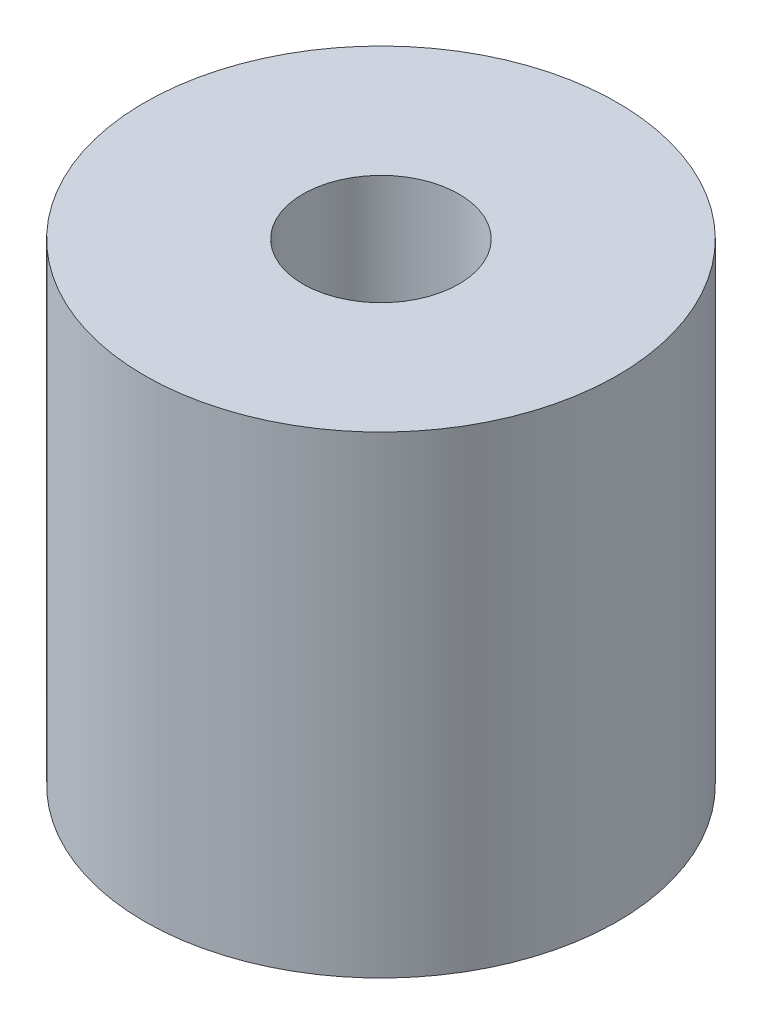
ISO-10303-21;
HEADER;
FILE_DESCRIPTION(('STEP AP214'),'2;1');
FILE_NAME('part.step','',(''),(''),'','','');
FILE_SCHEMA(('AUTOMOTIVE_DESIGN { 1 0 10303 214 1 1 1 1 }'));
ENDSEC;
DATA;
#1=APPLICATION_CONTEXT('core data for automotive mechanical design processes');
#2=APPLICATION_PROTOCOL_DEFINITION('international standard','automotive_design',2000,#1);
#3=PRODUCT_CONTEXT('',#1,'mechanical');
#4=PRODUCT('Part','Part','',(#3));
#5=PRODUCT_RELATED_PRODUCT_CATEGORY('part','',(#4));
#6=PRODUCT_DEFINITION_FORMATION('','',#4);
#7=PRODUCT_DEFINITION_CONTEXT('part definition',#1,'design');
#8=PRODUCT_DEFINITION('design','',#6,#7);
#9=PRODUCT_DEFINITION_SHAPE('','',#8);
#10=(LENGTH_UNIT() NAMED_UNIT(*) SI_UNIT(.MILLI.,.METRE.));
#11=(NAMED_UNIT(*) PLANE_ANGLE_UNIT() SI_UNIT($,.RADIAN.));
#12=(NAMED_UNIT(*) SI_UNIT($,.STERADIAN.) SOLID_ANGLE_UNIT());
#13=UNCERTAINTY_MEASURE_WITH_UNIT(LENGTH_MEASURE(1.E-05),#10,'distance_accuracy_value','');
#14=(GEOMETRIC_REPRESENTATION_CONTEXT(3) GLOBAL_UNCERTAINTY_ASSIGNED_CONTEXT((#13)) GLOBAL_UNIT_ASSIGNED_CONTEXT((#10,
#11,#12)) REPRESENTATION_CONTEXT('',''));
#15=CARTESIAN_POINT('',(0.,0.,0.));
#16=DIRECTION('',(0.,0.,1.));
#17=DIRECTION('',(1.,0.,0.));
#18=AXIS2_PLACEMENT_3D('',#15,#16,#17);
#19=CARTESIAN_POINT('',(0.,12.7,0.));
#20=DIRECTION('',(0.,1.,0.));
#21=DIRECTION('',(0.,0.,1.));
#22=AXIS2_PLACEMENT_3D('',#19,#20,#21);
#23=PLANE('',#22);
#24=CARTESIAN_POINT('',(0.,12.7,0.));
#25=DIRECTION('',(0.,1.,0.));
#26=DIRECTION('',(0.,0.,1.));
#27=AXIS2_PLACEMENT_3D('',#24,#25,#26);
#28=CIRCLE('',#27,6.35);
#29=CARTESIAN_POINT('',(0.,12.7,6.35));
#30=VERTEX_POINT('',#29);
#31=EDGE_CURVE('E10',#30,#30,#28,.T.);
#32=ORIENTED_EDGE('',*,*,#31,.T.);
#33=EDGE_LOOP('',(#32));
#34=FACE_BOUND('',#33,.T.);
#35=CARTESIAN_POINT('',(0.,12.7,0.));
#36=DIRECTION('',(0.,1.,0.));
#37=DIRECTION('',(0.,0.,1.));
#38=AXIS2_PLACEMENT_3D('',#35,#36,#37);
#39=CIRCLE('',#38,2.0955);
#40=CARTESIAN_POINT('',(0.,12.7,2.0955));
#41=VERTEX_POINT('',#40);
#42=EDGE_CURVE('E56',#41,#41,#39,.T.);
#43=ORIENTED_EDGE('',*,*,#42,.F.);
#44=EDGE_LOOP('',(#43));
#45=FACE_BOUND('',#44,.T.);
#46=ADVANCED_FACE('F43',(#34,#45),#23,.T.);
#47=CARTESIAN_POINT('',(0.,0.,0.));
#48=DIRECTION('',(0.,1.,0.));
#49=DIRECTION('',(0.,0.,1.));
#50=AXIS2_PLACEMENT_3D('',#47,#48,#49);
#51=PLANE('',#50);
#52=CARTESIAN_POINT('',(0.,0.,0.));
#53=DIRECTION('',(0.,1.,0.));
#54=DIRECTION('',(0.,0.,1.));
#55=AXIS2_PLACEMENT_3D('',#52,#53,#54);
#56=CIRCLE('',#55,6.35);
#57=CARTESIAN_POINT('',(0.,0.,6.35));
#58=VERTEX_POINT('',#57);
#59=EDGE_CURVE('E47',#58,#58,#56,.T.);
#60=ORIENTED_EDGE('',*,*,#59,.F.);
#61=EDGE_LOOP('',(#60));
#62=FACE_BOUND('',#61,.T.);
#63=CARTESIAN_POINT('',(0.,0.,0.));
#64=DIRECTION('',(0.,1.,0.));
#65=DIRECTION('',(0.,0.,1.));
#66=AXIS2_PLACEMENT_3D('',#63,#64,#65);
#67=CIRCLE('',#66,2.0955);
#68=CARTESIAN_POINT('',(0.,0.,2.0955));
#69=VERTEX_POINT('',#68);
#70=EDGE_CURVE('E58',#69,#69,#67,.T.);
#71=ORIENTED_EDGE('',*,*,#70,.T.);
#72=EDGE_LOOP('',(#71));
#73=FACE_BOUND('',#72,.T.);
#74=ADVANCED_FACE('F70',(#62,#73),#51,.F.);
#75=CARTESIAN_POINT('',(0.,12.7,0.));
#76=DIRECTION('',(0.,-1.,0.));
#77=DIRECTION('',(0.,0.,-1.));
#78=AXIS2_PLACEMENT_3D('',#75,#76,#77);
#79=CYLINDRICAL_SURFACE('',#78,6.35);
#80=ORIENTED_EDGE('',*,*,#31,.F.);
#81=EDGE_LOOP('',(#80));
#82=FACE_BOUND('',#81,.T.);
#83=ORIENTED_EDGE('',*,*,#59,.T.);
#84=EDGE_LOOP('',(#83));
#85=FACE_BOUND('',#84,.T.);
#86=ADVANCED_FACE('F45',(#82,#85),#79,.T.);
#87=CARTESIAN_POINT('',(0.,12.7,0.));
#88=DIRECTION('',(0.,-1.,0.));
#89=DIRECTION('',(0.,0.,-1.));
#90=AXIS2_PLACEMENT_3D('',#87,#88,#89);
#91=CYLINDRICAL_SURFACE('',#90,2.0955);
#92=ORIENTED_EDGE('',*,*,#42,.T.);
#93=EDGE_LOOP('',(#92));
#94=FACE_BOUND('',#93,.T.);
#95=ORIENTED_EDGE('',*,*,#70,.F.);
#96=EDGE_LOOP('',(#95));
#97=FACE_BOUND('',#96,.T.);
#98=ADVANCED_FACE('F66',(#94,#97),#91,.F.);
#99=CLOSED_SHELL('',(#46,#74,#86,#98));
#100=MANIFOLD_SOLID_BREP('B2',#99);
#101=ADVANCED_BREP_SHAPE_REPRESENTATION('',(#18,#100),#14);
#102=SHAPE_DEFINITION_REPRESENTATION(#9,#101);
ENDSEC;
END-ISO-10303-21;
